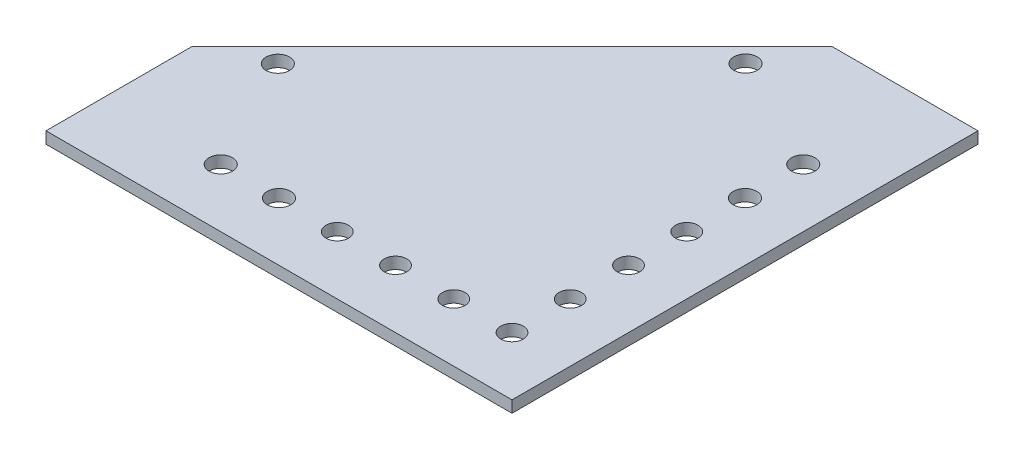
ISO-10303-21;
HEADER;
FILE_DESCRIPTION(('STEP AP214'),'2;1');
FILE_NAME('part.step','',(''),(''),'','','');
FILE_SCHEMA(('AUTOMOTIVE_DESIGN { 1 0 10303 214 1 1 1 1 }'));
ENDSEC;
DATA;
#1=APPLICATION_CONTEXT('core data for automotive mechanical design processes');
#2=APPLICATION_PROTOCOL_DEFINITION('international standard','automotive_design',2000,#1);
#3=PRODUCT_CONTEXT('',#1,'mechanical');
#4=PRODUCT('Part','Part','',(#3));
#5=PRODUCT_RELATED_PRODUCT_CATEGORY('part','',(#4));
#6=PRODUCT_DEFINITION_FORMATION('','',#4);
#7=PRODUCT_DEFINITION_CONTEXT('part definition',#1,'design');
#8=PRODUCT_DEFINITION('design','',#6,#7);
#9=PRODUCT_DEFINITION_SHAPE('','',#8);
#10=(LENGTH_UNIT() NAMED_UNIT(*) SI_UNIT(.MILLI.,.METRE.));
#11=(NAMED_UNIT(*) PLANE_ANGLE_UNIT() SI_UNIT($,.RADIAN.));
#12=(NAMED_UNIT(*) SI_UNIT($,.STERADIAN.) SOLID_ANGLE_UNIT());
#13=UNCERTAINTY_MEASURE_WITH_UNIT(LENGTH_MEASURE(1.E-05),#10,'distance_accuracy_value','');
#14=(GEOMETRIC_REPRESENTATION_CONTEXT(3) GLOBAL_UNCERTAINTY_ASSIGNED_CONTEXT((#13)) GLOBAL_UNIT_ASSIGNED_CONTEXT((#10,
#11,#12)) REPRESENTATION_CONTEXT('',''));
#15=CARTESIAN_POINT('',(0.,0.,0.));
#16=DIRECTION('',(0.,0.,1.));
#17=DIRECTION('',(1.,0.,0.));
#18=AXIS2_PLACEMENT_3D('',#15,#16,#17);
#19=CARTESIAN_POINT('',(53.8358565737051,1.27,36.0254980079681));
#20=DIRECTION('',(0.,0.,-1.));
#21=DIRECTION('',(-1.,0.,0.));
#22=AXIS2_PLACEMENT_3D('',#19,#20,#21);
#23=PLANE('',#22);
#24=DIRECTION('',(0.,1.,0.));
#25=VECTOR('',#24,1.);
#26=CARTESIAN_POINT('',(-47.7641434262949,-1.27,36.0254980079682));
#27=LINE('',#26,#25);
#28=CARTESIAN_POINT('',(-47.7641434262949,-1.27,36.0254980079682));
#29=VERTEX_POINT('',#28);
#30=CARTESIAN_POINT('',(-47.7641434262949,1.27,36.0254980079682));
#31=VERTEX_POINT('',#30);
#32=EDGE_CURVE('E83',#29,#31,#27,.T.);
#33=ORIENTED_EDGE('',*,*,#32,.F.);
#34=DIRECTION('',(1.,0.,0.));
#35=VECTOR('',#34,1.);
#36=CARTESIAN_POINT('',(53.8358565737051,-1.27,36.0254980079681));
#37=LINE('',#36,#35);
#38=CARTESIAN_POINT('',(53.8358565737051,-1.27,36.0254980079681));
#39=VERTEX_POINT('',#38);
#40=EDGE_CURVE('E92',#29,#39,#37,.T.);
#41=ORIENTED_EDGE('',*,*,#40,.T.);
#42=DIRECTION('',(0.,-1.,0.));
#43=VECTOR('',#42,1.);
#44=CARTESIAN_POINT('',(53.8358565737051,1.27,36.0254980079681));
#45=LINE('',#44,#43);
#46=CARTESIAN_POINT('',(53.8358565737051,1.27,36.0254980079681));
#47=VERTEX_POINT('',#46);
#48=EDGE_CURVE('E46',#47,#39,#45,.T.);
#49=ORIENTED_EDGE('',*,*,#48,.F.);
#50=DIRECTION('',(1.,0.,0.));
#51=VECTOR('',#50,1.);
#52=CARTESIAN_POINT('',(53.8358565737051,1.27,36.0254980079681));
#53=LINE('',#52,#51);
#54=EDGE_CURVE('E94',#31,#47,#53,.T.);
#55=ORIENTED_EDGE('',*,*,#54,.F.);
#56=EDGE_LOOP('',(#33,#41,#49,#55));
#57=FACE_BOUND('',#56,.T.);
#58=ADVANCED_FACE('F38',(#57),#23,.F.);
#59=CARTESIAN_POINT('',(53.8358565737051,1.27,-81.9942458709627));
#60=DIRECTION('',(-1.,0.,0.));
#61=DIRECTION('',(0.,0.,1.));
#62=AXIS2_PLACEMENT_3D('',#59,#60,#61);
#63=PLANE('',#62);
#64=DIRECTION('',(0.,1.,0.));
#65=VECTOR('',#64,1.);
#66=CARTESIAN_POINT('',(53.8358565737051,-1.27,-65.5745019920319));
#67=LINE('',#66,#65);
#68=CARTESIAN_POINT('',(53.8358565737051,-1.27,-65.5745019920319));
#69=VERTEX_POINT('',#68);
#70=CARTESIAN_POINT('',(53.8358565737051,1.27,-65.5745019920319));
#71=VERTEX_POINT('',#70);
#72=EDGE_CURVE('E53',#69,#71,#67,.T.);
#73=ORIENTED_EDGE('',*,*,#72,.T.);
#74=DIRECTION('',(0.,0.,-1.));
#75=VECTOR('',#74,1.);
#76=CARTESIAN_POINT('',(53.8358565737051,1.27,-81.9942458709627));
#77=LINE('',#76,#75);
#78=EDGE_CURVE('E122',#47,#71,#77,.T.);
#79=ORIENTED_EDGE('',*,*,#78,.F.);
#80=ORIENTED_EDGE('',*,*,#48,.T.);
#81=DIRECTION('',(0.,0.,-1.));
#82=VECTOR('',#81,1.);
#83=CARTESIAN_POINT('',(53.8358565737051,-1.27,-81.9942458709627));
#84=LINE('',#83,#82);
#85=EDGE_CURVE('E100',#39,#69,#84,.T.);
#86=ORIENTED_EDGE('',*,*,#85,.T.);
#87=EDGE_LOOP('',(#73,#79,#80,#86));
#88=FACE_BOUND('',#87,.T.);
#89=ADVANCED_FACE('F250',(#88),#63,.F.);
#90=CARTESIAN_POINT('',(-68.6740153657603,1.27,25.1853699474336));
#91=DIRECTION('',(0.707106781186548,0.,0.707106781186547));
#92=DIRECTION('',(0.707106781186547,0.,-0.707106781186548));
#93=AXIS2_PLACEMENT_3D('',#90,#91,#92);
#94=PLANE('',#93);
#95=DIRECTION('',(0.,-1.,0.));
#96=VECTOR('',#95,1.);
#97=CARTESIAN_POINT('',(-47.7641434262949,1.27,4.27549800796814));
#98=LINE('',#97,#96);
#99=CARTESIAN_POINT('',(-47.7641434262949,1.27,4.27549800796814));
#100=VERTEX_POINT('',#99);
#101=CARTESIAN_POINT('',(-47.7641434262949,-1.27,4.27549800796814));
#102=VERTEX_POINT('',#101);
#103=EDGE_CURVE('E61',#100,#102,#98,.T.);
#104=ORIENTED_EDGE('',*,*,#103,.F.);
#105=DIRECTION('',(-0.707106781186547,0.,0.707106781186548));
#106=VECTOR('',#105,1.);
#107=CARTESIAN_POINT('',(-68.6740153657603,1.27,25.1853699474336));
#108=LINE('',#107,#106);
#109=CARTESIAN_POINT('',(22.0858565737051,1.27,-65.5745019920319));
#110=VERTEX_POINT('',#109);
#111=EDGE_CURVE('E113',#110,#100,#108,.T.);
#112=ORIENTED_EDGE('',*,*,#111,.F.);
#113=DIRECTION('',(0.,1.,0.));
#114=VECTOR('',#113,1.);
#115=CARTESIAN_POINT('',(22.0858565737051,1.27,-65.5745019920319));
#116=LINE('',#115,#114);
#117=CARTESIAN_POINT('',(22.0858565737051,-1.27,-65.5745019920319));
#118=VERTEX_POINT('',#117);
#119=EDGE_CURVE('E96',#118,#110,#116,.T.);
#120=ORIENTED_EDGE('',*,*,#119,.F.);
#121=DIRECTION('',(-0.707106781186547,0.,0.707106781186548));
#122=VECTOR('',#121,1.);
#123=CARTESIAN_POINT('',(-68.6740153657603,-1.27,25.1853699474336));
#124=LINE('',#123,#122);
#125=EDGE_CURVE('E107',#118,#102,#124,.T.);
#126=ORIENTED_EDGE('',*,*,#125,.T.);
#127=EDGE_LOOP('',(#104,#112,#120,#126));
#128=FACE_BOUND('',#127,.T.);
#129=ADVANCED_FACE('F247',(#128),#94,.F.);
#130=CARTESIAN_POINT('',(-64.1838873052257,1.27,29.6754980079682));
#131=DIRECTION('',(0.,-1.,0.));
#132=DIRECTION('',(0.,0.,-1.));
#133=AXIS2_PLACEMENT_3D('',#130,#131,#132);
#134=PLANE('',#133);
#135=CARTESIAN_POINT('',(-9.66414342629486,1.27,23.3254980079681));
#136=DIRECTION('',(0.,1.,0.));
#137=DIRECTION('',(0.,0.,1.));
#138=AXIS2_PLACEMENT_3D('',#135,#136,#137);
#139=CIRCLE('',#138,2.55269999999999);
#140=CARTESIAN_POINT('',(-9.66414342629486,1.27,25.8781980079681));
#141=VERTEX_POINT('',#140);
#142=EDGE_CURVE('E226',#141,#141,#139,.T.);
#143=ORIENTED_EDGE('',*,*,#142,.F.);
#144=EDGE_LOOP('',(#143));
#145=FACE_BOUND('',#144,.T.);
#146=CARTESIAN_POINT('',(-22.3641434262949,1.27,23.3254980079681));
#147=DIRECTION('',(0.,1.,0.));
#148=DIRECTION('',(0.,0.,1.));
#149=AXIS2_PLACEMENT_3D('',#146,#147,#148);
#150=CIRCLE('',#149,2.55269999999999);
#151=CARTESIAN_POINT('',(-22.3641434262949,1.27,25.8781980079681));
#152=VERTEX_POINT('',#151);
#153=EDGE_CURVE('E218',#152,#152,#150,.T.);
#154=ORIENTED_EDGE('',*,*,#153,.F.);
#155=EDGE_LOOP('',(#154));
#156=FACE_BOUND('',#155,.T.);
#157=CARTESIAN_POINT('',(41.1358565737051,1.27,-27.4745019920319));
#158=DIRECTION('',(0.,1.,0.));
#159=DIRECTION('',(0.,0.,1.));
#160=AXIS2_PLACEMENT_3D('',#157,#158,#159);
#161=CIRCLE('',#160,2.55269999999999);
#162=CARTESIAN_POINT('',(41.1358565737051,1.27,-24.9218019920319));
#163=VERTEX_POINT('',#162);
#164=EDGE_CURVE('E210',#163,#163,#161,.T.);
#165=ORIENTED_EDGE('',*,*,#164,.F.);
#166=EDGE_LOOP('',(#165));
#167=FACE_BOUND('',#166,.T.);
#168=CARTESIAN_POINT('',(41.1358565737051,1.27,-40.1745019920319));
#169=DIRECTION('',(0.,1.,0.));
#170=DIRECTION('',(0.,0.,1.));
#171=AXIS2_PLACEMENT_3D('',#168,#169,#170);
#172=CIRCLE('',#171,2.55269999999999);
#173=CARTESIAN_POINT('',(41.1358565737051,1.27,-37.6218019920319));
#174=VERTEX_POINT('',#173);
#175=EDGE_CURVE('E202',#174,#174,#172,.T.);
#176=ORIENTED_EDGE('',*,*,#175,.F.);
#177=EDGE_LOOP('',(#176));
#178=FACE_BOUND('',#177,.T.);
#179=CARTESIAN_POINT('',(15.7957984183413,1.27,-52.9298228218263));
#180=DIRECTION('',(0.,1.,0.));
#181=DIRECTION('',(0.,0.,1.));
#182=AXIS2_PLACEMENT_3D('',#179,#180,#181);
#183=CIRCLE('',#182,2.55269999999999);
#184=CARTESIAN_POINT('',(15.7957984183413,1.27,-50.3771228218263));
#185=VERTEX_POINT('',#184);
#186=EDGE_CURVE('E194',#185,#185,#183,.T.);
#187=ORIENTED_EDGE('',*,*,#186,.F.);
#188=EDGE_LOOP('',(#187));
#189=FACE_BOUND('',#188,.T.);
#190=CARTESIAN_POINT('',(-35.1539130009736,1.27,-1.90263525647359));
#191=DIRECTION('',(0.,1.,0.));
#192=DIRECTION('',(0.,0.,1.));
#193=AXIS2_PLACEMENT_3D('',#190,#191,#192);
#194=CIRCLE('',#193,2.55269999999999);
#195=CARTESIAN_POINT('',(-35.1539130009736,1.27,0.650064743526404));
#196=VERTEX_POINT('',#195);
#197=EDGE_CURVE('E186',#196,#196,#194,.T.);
#198=ORIENTED_EDGE('',*,*,#197,.F.);
#199=EDGE_LOOP('',(#198));
#200=FACE_BOUND('',#199,.T.);
#201=CARTESIAN_POINT('',(41.1358565737051,1.27,23.3254980079681));
#202=DIRECTION('',(0.,1.,0.));
#203=DIRECTION('',(0.,0.,1.));
#204=AXIS2_PLACEMENT_3D('',#201,#202,#203);
#205=CIRCLE('',#204,2.45744999999999);
#206=CARTESIAN_POINT('',(41.1358565737051,1.27,25.7829480079681));
#207=VERTEX_POINT('',#206);
#208=EDGE_CURVE('E178',#207,#207,#205,.T.);
#209=ORIENTED_EDGE('',*,*,#208,.F.);
#210=EDGE_LOOP('',(#209));
#211=FACE_BOUND('',#210,.T.);
#212=CARTESIAN_POINT('',(28.4358565737051,1.27,23.3254980079681));
#213=DIRECTION('',(0.,1.,0.));
#214=DIRECTION('',(0.,0.,1.));
#215=AXIS2_PLACEMENT_3D('',#212,#213,#214);
#216=CIRCLE('',#215,2.45744999999999);
#217=CARTESIAN_POINT('',(28.4358565737051,1.27,25.7829480079681));
#218=VERTEX_POINT('',#217);
#219=EDGE_CURVE('E170',#218,#218,#216,.T.);
#220=ORIENTED_EDGE('',*,*,#219,.F.);
#221=EDGE_LOOP('',(#220));
#222=FACE_BOUND('',#221,.T.);
#223=CARTESIAN_POINT('',(15.7358565737051,1.27,23.3254980079681));
#224=DIRECTION('',(0.,1.,0.));
#225=DIRECTION('',(0.,0.,1.));
#226=AXIS2_PLACEMENT_3D('',#223,#224,#225);
#227=CIRCLE('',#226,2.45744999999999);
#228=CARTESIAN_POINT('',(15.7358565737051,1.27,25.7829480079681));
#229=VERTEX_POINT('',#228);
#230=EDGE_CURVE('E162',#229,#229,#227,.T.);
#231=ORIENTED_EDGE('',*,*,#230,.F.);
#232=EDGE_LOOP('',(#231));
#233=FACE_BOUND('',#232,.T.);
#234=CARTESIAN_POINT('',(3.03585657370514,1.27,23.3254980079681));
#235=DIRECTION('',(0.,1.,0.));
#236=DIRECTION('',(0.,0.,1.));
#237=AXIS2_PLACEMENT_3D('',#234,#235,#236);
#238=CIRCLE('',#237,2.45744999999999);
#239=CARTESIAN_POINT('',(3.03585657370514,1.27,25.7829480079681));
#240=VERTEX_POINT('',#239);
#241=EDGE_CURVE('E154',#240,#240,#238,.T.);
#242=ORIENTED_EDGE('',*,*,#241,.F.);
#243=EDGE_LOOP('',(#242));
#244=FACE_BOUND('',#243,.T.);
#245=CARTESIAN_POINT('',(41.1358565737051,1.27,10.6254980079681));
#246=DIRECTION('',(0.,1.,0.));
#247=DIRECTION('',(0.,0.,1.));
#248=AXIS2_PLACEMENT_3D('',#245,#246,#247);
#249=CIRCLE('',#248,2.45744999999999);
#250=CARTESIAN_POINT('',(41.1358565737051,1.27,13.0829480079681));
#251=VERTEX_POINT('',#250);
#252=EDGE_CURVE('E146',#251,#251,#249,.T.);
#253=ORIENTED_EDGE('',*,*,#252,.F.);
#254=EDGE_LOOP('',(#253));
#255=FACE_BOUND('',#254,.T.);
#256=CARTESIAN_POINT('',(41.1358565737051,1.27,-2.07450199203187));
#257=DIRECTION('',(0.,1.,0.));
#258=DIRECTION('',(0.,0.,1.));
#259=AXIS2_PLACEMENT_3D('',#256,#257,#258);
#260=CIRCLE('',#259,2.45744999999999);
#261=CARTESIAN_POINT('',(41.1358565737051,1.27,0.382948007968116));
#262=VERTEX_POINT('',#261);
#263=EDGE_CURVE('E138',#262,#262,#260,.T.);
#264=ORIENTED_EDGE('',*,*,#263,.F.);
#265=EDGE_LOOP('',(#264));
#266=FACE_BOUND('',#265,.T.);
#267=CARTESIAN_POINT('',(41.1358565737051,1.27,-14.7745019920319));
#268=DIRECTION('',(0.,1.,0.));
#269=DIRECTION('',(0.,0.,1.));
#270=AXIS2_PLACEMENT_3D('',#267,#268,#269);
#271=CIRCLE('',#270,2.45744999999999);
#272=CARTESIAN_POINT('',(41.1358565737051,1.27,-12.3170519920319));
#273=VERTEX_POINT('',#272);
#274=EDGE_CURVE('E110',#273,#273,#271,.T.);
#275=ORIENTED_EDGE('',*,*,#274,.F.);
#276=EDGE_LOOP('',(#275));
#277=FACE_BOUND('',#276,.T.);
#278=DIRECTION('',(0.,0.,1.));
#279=VECTOR('',#278,1.);
#280=CARTESIAN_POINT('',(-47.7641434262949,1.27,36.0254980079682));
#281=LINE('',#280,#279);
#282=EDGE_CURVE('E237',#100,#31,#281,.T.);
#283=ORIENTED_EDGE('',*,*,#282,.T.);
#284=ORIENTED_EDGE('',*,*,#54,.T.);
#285=ORIENTED_EDGE('',*,*,#78,.T.);
#286=DIRECTION('',(-1.,0.,0.));
#287=VECTOR('',#286,1.);
#288=CARTESIAN_POINT('',(53.8358565737051,1.27,-65.5745019920319));
#289=LINE('',#288,#287);
#290=EDGE_CURVE('E240',#71,#110,#289,.T.);
#291=ORIENTED_EDGE('',*,*,#290,.T.);
#292=ORIENTED_EDGE('',*,*,#111,.T.);
#293=EDGE_LOOP('',(#283,#284,#285,#291,#292));
#294=FACE_BOUND('',#293,.T.);
#295=ADVANCED_FACE('F249',(#145,#156,#167,#178,#189,#200,#211,#222,#233,#244,#255,#266,#277,
#294),#134,.F.);
#296=CARTESIAN_POINT('',(-64.1838873052257,-1.27,29.6754980079682));
#297=DIRECTION('',(0.,-1.,0.));
#298=DIRECTION('',(0.,0.,-1.));
#299=AXIS2_PLACEMENT_3D('',#296,#297,#298);
#300=PLANE('',#299);
#301=CARTESIAN_POINT('',(-9.66414342629486,-1.27,23.3254980079681));
#302=DIRECTION('',(0.,1.,0.));
#303=DIRECTION('',(0.,0.,1.));
#304=AXIS2_PLACEMENT_3D('',#301,#302,#303);
#305=CIRCLE('',#304,2.5527);
#306=CARTESIAN_POINT('',(-9.66414342629486,-1.27,25.8781980079681));
#307=VERTEX_POINT('',#306);
#308=EDGE_CURVE('E222',#307,#307,#305,.T.);
#309=ORIENTED_EDGE('',*,*,#308,.T.);
#310=EDGE_LOOP('',(#309));
#311=FACE_BOUND('',#310,.T.);
#312=CARTESIAN_POINT('',(-22.3641434262949,-1.27,23.3254980079681));
#313=DIRECTION('',(0.,1.,0.));
#314=DIRECTION('',(0.,0.,1.));
#315=AXIS2_PLACEMENT_3D('',#312,#313,#314);
#316=CIRCLE('',#315,2.5527);
#317=CARTESIAN_POINT('',(-22.3641434262949,-1.27,25.8781980079681));
#318=VERTEX_POINT('',#317);
#319=EDGE_CURVE('E214',#318,#318,#316,.T.);
#320=ORIENTED_EDGE('',*,*,#319,.T.);
#321=EDGE_LOOP('',(#320));
#322=FACE_BOUND('',#321,.T.);
#323=CARTESIAN_POINT('',(41.1358565737051,-1.27,-27.4745019920319));
#324=DIRECTION('',(0.,1.,0.));
#325=DIRECTION('',(0.,0.,1.));
#326=AXIS2_PLACEMENT_3D('',#323,#324,#325);
#327=CIRCLE('',#326,2.5527);
#328=CARTESIAN_POINT('',(41.1358565737051,-1.27,-24.9218019920319));
#329=VERTEX_POINT('',#328);
#330=EDGE_CURVE('E206',#329,#329,#327,.T.);
#331=ORIENTED_EDGE('',*,*,#330,.T.);
#332=EDGE_LOOP('',(#331));
#333=FACE_BOUND('',#332,.T.);
#334=CARTESIAN_POINT('',(41.1358565737051,-1.27,-40.1745019920319));
#335=DIRECTION('',(0.,1.,0.));
#336=DIRECTION('',(0.,0.,1.));
#337=AXIS2_PLACEMENT_3D('',#334,#335,#336);
#338=CIRCLE('',#337,2.5527);
#339=CARTESIAN_POINT('',(41.1358565737051,-1.27,-37.6218019920319));
#340=VERTEX_POINT('',#339);
#341=EDGE_CURVE('E198',#340,#340,#338,.T.);
#342=ORIENTED_EDGE('',*,*,#341,.T.);
#343=EDGE_LOOP('',(#342));
#344=FACE_BOUND('',#343,.T.);
#345=CARTESIAN_POINT('',(15.7957984183413,-1.27,-52.9298228218263));
#346=DIRECTION('',(0.,1.,0.));
#347=DIRECTION('',(0.,0.,1.));
#348=AXIS2_PLACEMENT_3D('',#345,#346,#347);
#349=CIRCLE('',#348,2.5527);
#350=CARTESIAN_POINT('',(15.7957984183413,-1.27,-50.3771228218263));
#351=VERTEX_POINT('',#350);
#352=EDGE_CURVE('E190',#351,#351,#349,.T.);
#353=ORIENTED_EDGE('',*,*,#352,.T.);
#354=EDGE_LOOP('',(#353));
#355=FACE_BOUND('',#354,.T.);
#356=CARTESIAN_POINT('',(-35.1539130009736,-1.27,-1.90263525647359));
#357=DIRECTION('',(0.,1.,0.));
#358=DIRECTION('',(0.,0.,1.));
#359=AXIS2_PLACEMENT_3D('',#356,#357,#358);
#360=CIRCLE('',#359,2.5527);
#361=CARTESIAN_POINT('',(-35.1539130009736,-1.27,0.650064743526411));
#362=VERTEX_POINT('',#361);
#363=EDGE_CURVE('E182',#362,#362,#360,.T.);
#364=ORIENTED_EDGE('',*,*,#363,.T.);
#365=EDGE_LOOP('',(#364));
#366=FACE_BOUND('',#365,.T.);
#367=CARTESIAN_POINT('',(41.1358565737051,-1.27,23.3254980079681));
#368=DIRECTION('',(0.,1.,0.));
#369=DIRECTION('',(0.,0.,1.));
#370=AXIS2_PLACEMENT_3D('',#367,#368,#369);
#371=CIRCLE('',#370,2.45745);
#372=CARTESIAN_POINT('',(41.1358565737051,-1.27,25.7829480079681));
#373=VERTEX_POINT('',#372);
#374=EDGE_CURVE('E174',#373,#373,#371,.T.);
#375=ORIENTED_EDGE('',*,*,#374,.T.);
#376=EDGE_LOOP('',(#375));
#377=FACE_BOUND('',#376,.T.);
#378=CARTESIAN_POINT('',(28.4358565737051,-1.27,23.3254980079681));
#379=DIRECTION('',(0.,1.,0.));
#380=DIRECTION('',(0.,0.,1.));
#381=AXIS2_PLACEMENT_3D('',#378,#379,#380);
#382=CIRCLE('',#381,2.45745);
#383=CARTESIAN_POINT('',(28.4358565737051,-1.27,25.7829480079681));
#384=VERTEX_POINT('',#383);
#385=EDGE_CURVE('E166',#384,#384,#382,.T.);
#386=ORIENTED_EDGE('',*,*,#385,.T.);
#387=EDGE_LOOP('',(#386));
#388=FACE_BOUND('',#387,.T.);
#389=CARTESIAN_POINT('',(15.7358565737051,-1.27,23.3254980079681));
#390=DIRECTION('',(0.,1.,0.));
#391=DIRECTION('',(0.,0.,1.));
#392=AXIS2_PLACEMENT_3D('',#389,#390,#391);
#393=CIRCLE('',#392,2.45745);
#394=CARTESIAN_POINT('',(15.7358565737051,-1.27,25.7829480079681));
#395=VERTEX_POINT('',#394);
#396=EDGE_CURVE('E158',#395,#395,#393,.T.);
#397=ORIENTED_EDGE('',*,*,#396,.T.);
#398=EDGE_LOOP('',(#397));
#399=FACE_BOUND('',#398,.T.);
#400=CARTESIAN_POINT('',(3.03585657370514,-1.27,23.3254980079681));
#401=DIRECTION('',(0.,1.,0.));
#402=DIRECTION('',(0.,0.,1.));
#403=AXIS2_PLACEMENT_3D('',#400,#401,#402);
#404=CIRCLE('',#403,2.45745);
#405=CARTESIAN_POINT('',(3.03585657370514,-1.27,25.7829480079681));
#406=VERTEX_POINT('',#405);
#407=EDGE_CURVE('E150',#406,#406,#404,.T.);
#408=ORIENTED_EDGE('',*,*,#407,.T.);
#409=EDGE_LOOP('',(#408));
#410=FACE_BOUND('',#409,.T.);
#411=CARTESIAN_POINT('',(41.1358565737051,-1.27,10.6254980079681));
#412=DIRECTION('',(0.,1.,0.));
#413=DIRECTION('',(0.,0.,1.));
#414=AXIS2_PLACEMENT_3D('',#411,#412,#413);
#415=CIRCLE('',#414,2.45745);
#416=CARTESIAN_POINT('',(41.1358565737051,-1.27,13.0829480079681));
#417=VERTEX_POINT('',#416);
#418=EDGE_CURVE('E142',#417,#417,#415,.T.);
#419=ORIENTED_EDGE('',*,*,#418,.T.);
#420=EDGE_LOOP('',(#419));
#421=FACE_BOUND('',#420,.T.);
#422=CARTESIAN_POINT('',(41.1358565737051,-1.27,-2.07450199203187));
#423=DIRECTION('',(0.,1.,0.));
#424=DIRECTION('',(0.,0.,1.));
#425=AXIS2_PLACEMENT_3D('',#422,#423,#424);
#426=CIRCLE('',#425,2.45745);
#427=CARTESIAN_POINT('',(41.1358565737051,-1.27,0.38294800796813));
#428=VERTEX_POINT('',#427);
#429=EDGE_CURVE('E134',#428,#428,#426,.T.);
#430=ORIENTED_EDGE('',*,*,#429,.T.);
#431=EDGE_LOOP('',(#430));
#432=FACE_BOUND('',#431,.T.);
#433=CARTESIAN_POINT('',(41.1358565737051,-1.27,-14.7745019920319));
#434=DIRECTION('',(0.,1.,0.));
#435=DIRECTION('',(0.,0.,1.));
#436=AXIS2_PLACEMENT_3D('',#433,#434,#435);
#437=CIRCLE('',#436,2.45745);
#438=CARTESIAN_POINT('',(41.1358565737051,-1.27,-12.3170519920319));
#439=VERTEX_POINT('',#438);
#440=EDGE_CURVE('E103',#439,#439,#437,.T.);
#441=ORIENTED_EDGE('',*,*,#440,.T.);
#442=EDGE_LOOP('',(#441));
#443=FACE_BOUND('',#442,.T.);
#444=ORIENTED_EDGE('',*,*,#40,.F.);
#445=DIRECTION('',(0.,0.,-1.));
#446=VECTOR('',#445,1.);
#447=CARTESIAN_POINT('',(-47.7641434262949,-1.27,29.6754980079682));
#448=LINE('',#447,#446);
#449=EDGE_CURVE('E11',#29,#102,#448,.T.);
#450=ORIENTED_EDGE('',*,*,#449,.T.);
#451=ORIENTED_EDGE('',*,*,#125,.F.);
#452=DIRECTION('',(-1.,0.,0.));
#453=VECTOR('',#452,1.);
#454=CARTESIAN_POINT('',(53.8358565737051,-1.27,-65.5745019920319));
#455=LINE('',#454,#453);
#456=EDGE_CURVE('E235',#69,#118,#455,.T.);
#457=ORIENTED_EDGE('',*,*,#456,.F.);
#458=ORIENTED_EDGE('',*,*,#85,.F.);
#459=EDGE_LOOP('',(#444,#450,#451,#457,#458));
#460=FACE_BOUND('',#459,.T.);
#461=ADVANCED_FACE('F98',(#311,#322,#333,#344,#355,#366,#377,#388,#399,#410,#421,#432,#443,
#460),#300,.T.);
#462=CARTESIAN_POINT('',(41.1358565737051,1.27,-14.7745019920319));
#463=DIRECTION('',(0.,1.,0.));
#464=DIRECTION('',(0.,0.,1.));
#465=AXIS2_PLACEMENT_3D('',#462,#463,#464);
#466=CYLINDRICAL_SURFACE('',#465,2.45744999999999);
#467=ORIENTED_EDGE('',*,*,#440,.F.);
#468=EDGE_LOOP('',(#467));
#469=FACE_BOUND('',#468,.T.);
#470=ORIENTED_EDGE('',*,*,#274,.T.);
#471=EDGE_LOOP('',(#470));
#472=FACE_BOUND('',#471,.T.);
#473=ADVANCED_FACE('F292',(#469,#472),#466,.F.);
#474=CARTESIAN_POINT('',(41.1358565737051,1.27,-2.07450199203187));
#475=DIRECTION('',(0.,1.,0.));
#476=DIRECTION('',(0.,0.,1.));
#477=AXIS2_PLACEMENT_3D('',#474,#475,#476);
#478=CYLINDRICAL_SURFACE('',#477,2.45744999999999);
#479=ORIENTED_EDGE('',*,*,#429,.F.);
#480=EDGE_LOOP('',(#479));
#481=FACE_BOUND('',#480,.T.);
#482=ORIENTED_EDGE('',*,*,#263,.T.);
#483=EDGE_LOOP('',(#482));
#484=FACE_BOUND('',#483,.T.);
#485=ADVANCED_FACE('F386',(#481,#484),#478,.F.);
#486=CARTESIAN_POINT('',(41.1358565737051,1.27,10.6254980079681));
#487=DIRECTION('',(0.,1.,0.));
#488=DIRECTION('',(0.,0.,1.));
#489=AXIS2_PLACEMENT_3D('',#486,#487,#488);
#490=CYLINDRICAL_SURFACE('',#489,2.45744999999999);
#491=ORIENTED_EDGE('',*,*,#418,.F.);
#492=EDGE_LOOP('',(#491));
#493=FACE_BOUND('',#492,.T.);
#494=ORIENTED_EDGE('',*,*,#252,.T.);
#495=EDGE_LOOP('',(#494));
#496=FACE_BOUND('',#495,.T.);
#497=ADVANCED_FACE('F377',(#493,#496),#490,.F.);
#498=CARTESIAN_POINT('',(3.03585657370514,1.27,23.3254980079681));
#499=DIRECTION('',(0.,1.,0.));
#500=DIRECTION('',(0.,0.,1.));
#501=AXIS2_PLACEMENT_3D('',#498,#499,#500);
#502=CYLINDRICAL_SURFACE('',#501,2.45744999999999);
#503=ORIENTED_EDGE('',*,*,#407,.F.);
#504=EDGE_LOOP('',(#503));
#505=FACE_BOUND('',#504,.T.);
#506=ORIENTED_EDGE('',*,*,#241,.T.);
#507=EDGE_LOOP('',(#506));
#508=FACE_BOUND('',#507,.T.);
#509=ADVANCED_FACE('F368',(#505,#508),#502,.F.);
#510=CARTESIAN_POINT('',(15.7358565737051,1.27,23.3254980079681));
#511=DIRECTION('',(0.,1.,0.));
#512=DIRECTION('',(0.,0.,1.));
#513=AXIS2_PLACEMENT_3D('',#510,#511,#512);
#514=CYLINDRICAL_SURFACE('',#513,2.45744999999999);
#515=ORIENTED_EDGE('',*,*,#396,.F.);
#516=EDGE_LOOP('',(#515));
#517=FACE_BOUND('',#516,.T.);
#518=ORIENTED_EDGE('',*,*,#230,.T.);
#519=EDGE_LOOP('',(#518));
#520=FACE_BOUND('',#519,.T.);
#521=ADVANCED_FACE('F359',(#517,#520),#514,.F.);
#522=CARTESIAN_POINT('',(28.4358565737051,1.27,23.3254980079681));
#523=DIRECTION('',(0.,1.,0.));
#524=DIRECTION('',(0.,0.,1.));
#525=AXIS2_PLACEMENT_3D('',#522,#523,#524);
#526=CYLINDRICAL_SURFACE('',#525,2.45744999999999);
#527=ORIENTED_EDGE('',*,*,#385,.F.);
#528=EDGE_LOOP('',(#527));
#529=FACE_BOUND('',#528,.T.);
#530=ORIENTED_EDGE('',*,*,#219,.T.);
#531=EDGE_LOOP('',(#530));
#532=FACE_BOUND('',#531,.T.);
#533=ADVANCED_FACE('F350',(#529,#532),#526,.F.);
#534=CARTESIAN_POINT('',(41.1358565737051,1.27,23.3254980079681));
#535=DIRECTION('',(0.,1.,0.));
#536=DIRECTION('',(0.,0.,1.));
#537=AXIS2_PLACEMENT_3D('',#534,#535,#536);
#538=CYLINDRICAL_SURFACE('',#537,2.45744999999999);
#539=ORIENTED_EDGE('',*,*,#374,.F.);
#540=EDGE_LOOP('',(#539));
#541=FACE_BOUND('',#540,.T.);
#542=ORIENTED_EDGE('',*,*,#208,.T.);
#543=EDGE_LOOP('',(#542));
#544=FACE_BOUND('',#543,.T.);
#545=ADVANCED_FACE('F341',(#541,#544),#538,.F.);
#546=CARTESIAN_POINT('',(-35.1539130009736,1.27,-1.90263525647359));
#547=DIRECTION('',(0.,1.,0.));
#548=DIRECTION('',(0.,0.,1.));
#549=AXIS2_PLACEMENT_3D('',#546,#547,#548);
#550=CYLINDRICAL_SURFACE('',#549,2.55269999999999);
#551=ORIENTED_EDGE('',*,*,#363,.F.);
#552=EDGE_LOOP('',(#551));
#553=FACE_BOUND('',#552,.T.);
#554=ORIENTED_EDGE('',*,*,#197,.T.);
#555=EDGE_LOOP('',(#554));
#556=FACE_BOUND('',#555,.T.);
#557=ADVANCED_FACE('F332',(#553,#556),#550,.F.);
#558=CARTESIAN_POINT('',(15.7957984183413,1.27,-52.9298228218263));
#559=DIRECTION('',(0.,1.,0.));
#560=DIRECTION('',(0.,0.,1.));
#561=AXIS2_PLACEMENT_3D('',#558,#559,#560);
#562=CYLINDRICAL_SURFACE('',#561,2.55269999999999);
#563=ORIENTED_EDGE('',*,*,#352,.F.);
#564=EDGE_LOOP('',(#563));
#565=FACE_BOUND('',#564,.T.);
#566=ORIENTED_EDGE('',*,*,#186,.T.);
#567=EDGE_LOOP('',(#566));
#568=FACE_BOUND('',#567,.T.);
#569=ADVANCED_FACE('F323',(#565,#568),#562,.F.);
#570=CARTESIAN_POINT('',(41.1358565737051,1.27,-40.1745019920319));
#571=DIRECTION('',(0.,1.,0.));
#572=DIRECTION('',(0.,0.,1.));
#573=AXIS2_PLACEMENT_3D('',#570,#571,#572);
#574=CYLINDRICAL_SURFACE('',#573,2.55269999999999);
#575=ORIENTED_EDGE('',*,*,#341,.F.);
#576=EDGE_LOOP('',(#575));
#577=FACE_BOUND('',#576,.T.);
#578=ORIENTED_EDGE('',*,*,#175,.T.);
#579=EDGE_LOOP('',(#578));
#580=FACE_BOUND('',#579,.T.);
#581=ADVANCED_FACE('F314',(#577,#580),#574,.F.);
#582=CARTESIAN_POINT('',(41.1358565737051,1.27,-27.4745019920319));
#583=DIRECTION('',(0.,1.,0.));
#584=DIRECTION('',(0.,0.,1.));
#585=AXIS2_PLACEMENT_3D('',#582,#583,#584);
#586=CYLINDRICAL_SURFACE('',#585,2.55269999999999);
#587=ORIENTED_EDGE('',*,*,#330,.F.);
#588=EDGE_LOOP('',(#587));
#589=FACE_BOUND('',#588,.T.);
#590=ORIENTED_EDGE('',*,*,#164,.T.);
#591=EDGE_LOOP('',(#590));
#592=FACE_BOUND('',#591,.T.);
#593=ADVANCED_FACE('F305',(#589,#592),#586,.F.);
#594=CARTESIAN_POINT('',(-22.3641434262949,1.27,23.3254980079681));
#595=DIRECTION('',(0.,1.,0.));
#596=DIRECTION('',(0.,0.,1.));
#597=AXIS2_PLACEMENT_3D('',#594,#595,#596);
#598=CYLINDRICAL_SURFACE('',#597,2.55269999999999);
#599=ORIENTED_EDGE('',*,*,#319,.F.);
#600=EDGE_LOOP('',(#599));
#601=FACE_BOUND('',#600,.T.);
#602=ORIENTED_EDGE('',*,*,#153,.T.);
#603=EDGE_LOOP('',(#602));
#604=FACE_BOUND('',#603,.T.);
#605=ADVANCED_FACE('F298',(#601,#604),#598,.F.);
#606=CARTESIAN_POINT('',(-9.66414342629486,1.27,23.3254980079681));
#607=DIRECTION('',(0.,1.,0.));
#608=DIRECTION('',(0.,0.,1.));
#609=AXIS2_PLACEMENT_3D('',#606,#607,#608);
#610=CYLINDRICAL_SURFACE('',#609,2.55269999999999);
#611=ORIENTED_EDGE('',*,*,#308,.F.);
#612=EDGE_LOOP('',(#611));
#613=FACE_BOUND('',#612,.T.);
#614=ORIENTED_EDGE('',*,*,#142,.T.);
#615=EDGE_LOOP('',(#614));
#616=FACE_BOUND('',#615,.T.);
#617=ADVANCED_FACE('F268',(#613,#616),#610,.F.);
#618=CARTESIAN_POINT('',(53.8358565737051,-1.27,-65.5745019920319));
#619=DIRECTION('',(0.,0.,-1.));
#620=DIRECTION('',(-1.,0.,0.));
#621=AXIS2_PLACEMENT_3D('',#618,#619,#620);
#622=PLANE('',#621);
#623=ORIENTED_EDGE('',*,*,#119,.T.);
#624=ORIENTED_EDGE('',*,*,#290,.F.);
#625=ORIENTED_EDGE('',*,*,#72,.F.);
#626=ORIENTED_EDGE('',*,*,#456,.T.);
#627=EDGE_LOOP('',(#623,#624,#625,#626));
#628=FACE_BOUND('',#627,.T.);
#629=ADVANCED_FACE('F245',(#628),#622,.T.);
#630=CARTESIAN_POINT('',(-47.7641434262949,-1.27,36.0254980079682));
#631=DIRECTION('',(-1.,0.,0.));
#632=DIRECTION('',(0.,0.,1.));
#633=AXIS2_PLACEMENT_3D('',#630,#631,#632);
#634=PLANE('',#633);
#635=ORIENTED_EDGE('',*,*,#103,.T.);
#636=ORIENTED_EDGE('',*,*,#449,.F.);
#637=ORIENTED_EDGE('',*,*,#32,.T.);
#638=ORIENTED_EDGE('',*,*,#282,.F.);
#639=EDGE_LOOP('',(#635,#636,#637,#638));
#640=FACE_BOUND('',#639,.T.);
#641=ADVANCED_FACE('F82',(#640),#634,.T.);
#642=CLOSED_SHELL('',(#58,#89,#129,#295,#461,#473,#485,#497,#509,#521,#533,#545,#557,#569,#581,
#593,#605,#617,#629,#641));
#643=MANIFOLD_SOLID_BREP('B2',#642);
#644=ADVANCED_BREP_SHAPE_REPRESENTATION('',(#18,#643),#14);
#645=SHAPE_DEFINITION_REPRESENTATION(#9,#644);
ENDSEC;
END-ISO-10303-21;
